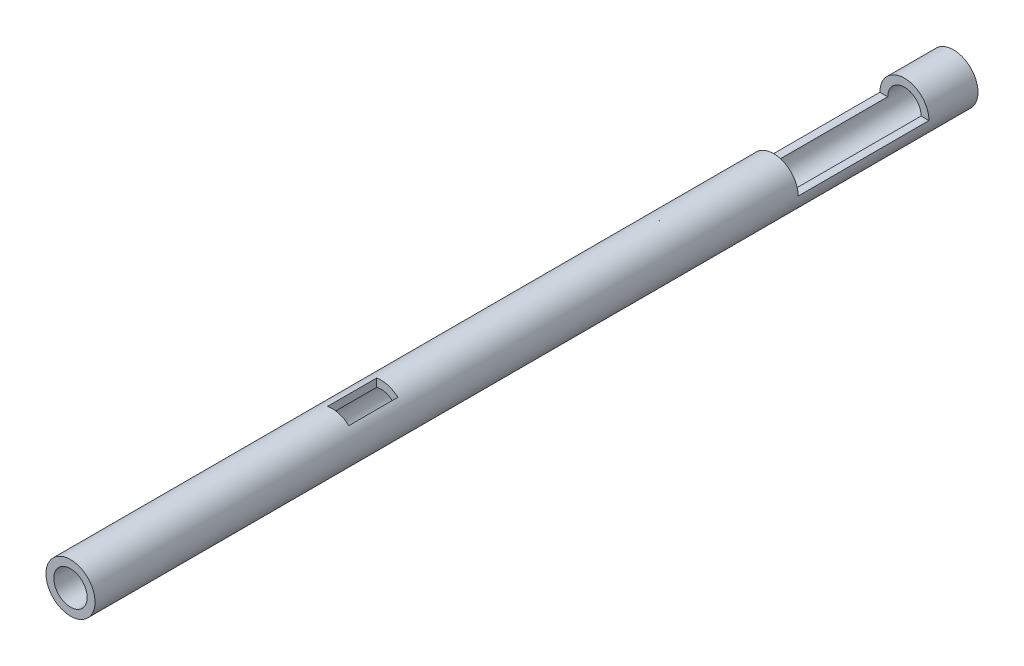
ISO-10303-21;
HEADER;
FILE_DESCRIPTION(('STEP AP214'),'2;1');
FILE_NAME('part.step','',(''),(''),'','','');
FILE_SCHEMA(('AUTOMOTIVE_DESIGN { 1 0 10303 214 1 1 1 1 }'));
ENDSEC;
DATA;
#1=APPLICATION_CONTEXT('core data for automotive mechanical design processes');
#2=APPLICATION_PROTOCOL_DEFINITION('international standard','automotive_design',2000,#1);
#3=PRODUCT_CONTEXT('',#1,'mechanical');
#4=PRODUCT('Part','Part','',(#3));
#5=PRODUCT_RELATED_PRODUCT_CATEGORY('part','',(#4));
#6=PRODUCT_DEFINITION_FORMATION('','',#4);
#7=PRODUCT_DEFINITION_CONTEXT('part definition',#1,'design');
#8=PRODUCT_DEFINITION('design','',#6,#7);
#9=PRODUCT_DEFINITION_SHAPE('','',#8);
#10=(LENGTH_UNIT() NAMED_UNIT(*) SI_UNIT(.MILLI.,.METRE.));
#11=(NAMED_UNIT(*) PLANE_ANGLE_UNIT() SI_UNIT($,.RADIAN.));
#12=(NAMED_UNIT(*) SI_UNIT($,.STERADIAN.) SOLID_ANGLE_UNIT());
#13=UNCERTAINTY_MEASURE_WITH_UNIT(LENGTH_MEASURE(1.E-05),#10,'distance_accuracy_value','');
#14=(GEOMETRIC_REPRESENTATION_CONTEXT(3) GLOBAL_UNCERTAINTY_ASSIGNED_CONTEXT((#13)) GLOBAL_UNIT_ASSIGNED_CONTEXT((#10,
#11,#12)) REPRESENTATION_CONTEXT('',''));
#15=CARTESIAN_POINT('',(0.,0.,0.));
#16=DIRECTION('',(0.,0.,1.));
#17=DIRECTION('',(1.,0.,0.));
#18=AXIS2_PLACEMENT_3D('',#15,#16,#17);
#19=CARTESIAN_POINT('',(0.,0.,685.8));
#20=DIRECTION('',(0.,0.,-1.));
#21=DIRECTION('',(-1.,0.,0.));
#22=AXIS2_PLACEMENT_3D('',#19,#20,#21);
#23=CYLINDRICAL_SURFACE('',#22,19.05);
#24=DIRECTION('',(0.,0.,-1.));
#25=VECTOR('',#24,1.);
#26=CARTESIAN_POINT('',(19.05,0.,685.8));
#27=LINE('',#26,#25);
#28=CARTESIAN_POINT('',(19.05,0.,38.1));
#29=VERTEX_POINT('',#28);
#30=CARTESIAN_POINT('',(19.05,0.,139.7));
#31=VERTEX_POINT('',#30);
#32=EDGE_CURVE('E203',#29,#31,#27,.F.);
#33=ORIENTED_EDGE('',*,*,#32,.T.);
#34=CARTESIAN_POINT('',(0.,0.,139.7));
#35=DIRECTION('',(0.,0.,-1.));
#36=DIRECTION('',(-1.,0.,0.));
#37=AXIS2_PLACEMENT_3D('',#34,#35,#36);
#38=CIRCLE('',#37,19.05);
#39=CARTESIAN_POINT('',(-19.05,0.,139.7));
#40=VERTEX_POINT('',#39);
#41=EDGE_CURVE('E178',#31,#40,#38,.F.);
#42=ORIENTED_EDGE('',*,*,#41,.T.);
#43=DIRECTION('',(0.,0.,-1.));
#44=VECTOR('',#43,1.);
#45=CARTESIAN_POINT('',(-19.05,0.,685.8));
#46=LINE('',#45,#44);
#47=CARTESIAN_POINT('',(-19.05,0.,38.1));
#48=VERTEX_POINT('',#47);
#49=EDGE_CURVE('E199',#40,#48,#46,.T.);
#50=ORIENTED_EDGE('',*,*,#49,.T.);
#51=CARTESIAN_POINT('',(0.,0.,38.1));
#52=DIRECTION('',(0.,0.,1.));
#53=DIRECTION('',(1.,0.,0.));
#54=AXIS2_PLACEMENT_3D('',#51,#52,#53);
#55=CIRCLE('',#54,19.05);
#56=EDGE_CURVE('E174',#48,#29,#55,.F.);
#57=ORIENTED_EDGE('',*,*,#56,.T.);
#58=EDGE_LOOP('',(#33,#42,#50,#57));
#59=FACE_BOUND('',#58,.T.);
#60=CARTESIAN_POINT('',(0.,0.,685.8));
#61=DIRECTION('',(0.,0.,1.));
#62=DIRECTION('',(1.,0.,0.));
#63=AXIS2_PLACEMENT_3D('',#60,#61,#62);
#64=CIRCLE('',#63,19.05);
#65=CARTESIAN_POINT('',(19.05,0.,685.8));
#66=VERTEX_POINT('',#65);
#67=EDGE_CURVE('E11',#66,#66,#64,.T.);
#68=ORIENTED_EDGE('',*,*,#67,.F.);
#69=EDGE_LOOP('',(#68));
#70=FACE_BOUND('',#69,.T.);
#71=CARTESIAN_POINT('',(0.,0.,0.));
#72=DIRECTION('',(0.,0.,1.));
#73=DIRECTION('',(1.,0.,0.));
#74=AXIS2_PLACEMENT_3D('',#71,#72,#73);
#75=CIRCLE('',#74,19.05);
#76=CARTESIAN_POINT('',(19.05,0.,0.));
#77=VERTEX_POINT('',#76);
#78=EDGE_CURVE('E42',#77,#77,#75,.T.);
#79=ORIENTED_EDGE('',*,*,#78,.T.);
#80=EDGE_LOOP('',(#79));
#81=FACE_BOUND('',#80,.T.);
#82=CARTESIAN_POINT('',(0.,0.,444.5));
#83=DIRECTION('',(0.,0.,1.));
#84=DIRECTION('',(1.,0.,0.));
#85=AXIS2_PLACEMENT_3D('',#82,#83,#84);
#86=CIRCLE('',#85,19.05);
#87=CARTESIAN_POINT('',(-3.556,18.7151640121053,444.5));
#88=VERTEX_POINT('',#87);
#89=CARTESIAN_POINT('',(12.954,13.9676907182254,444.5));
#90=VERTEX_POINT('',#89);
#91=EDGE_CURVE('E123',#88,#90,#86,.F.);
#92=ORIENTED_EDGE('',*,*,#91,.T.);
#93=DIRECTION('',(0.,0.,-1.));
#94=VECTOR('',#93,1.);
#95=CARTESIAN_POINT('',(12.954,13.9676907182254,685.8));
#96=LINE('',#95,#94);
#97=CARTESIAN_POINT('',(12.954,13.9676907182254,482.6));
#98=VERTEX_POINT('',#97);
#99=EDGE_CURVE('E164',#90,#98,#96,.F.);
#100=ORIENTED_EDGE('',*,*,#99,.T.);
#101=CARTESIAN_POINT('',(0.,0.,482.6));
#102=DIRECTION('',(0.,0.,-1.));
#103=DIRECTION('',(-1.,0.,0.));
#104=AXIS2_PLACEMENT_3D('',#101,#102,#103);
#105=CIRCLE('',#104,19.05);
#106=CARTESIAN_POINT('',(-3.556,18.7151640121053,482.6));
#107=VERTEX_POINT('',#106);
#108=EDGE_CURVE('E131',#98,#107,#105,.F.);
#109=ORIENTED_EDGE('',*,*,#108,.T.);
#110=DIRECTION('',(0.,0.,-1.));
#111=VECTOR('',#110,1.);
#112=CARTESIAN_POINT('',(-3.556,18.7151640121053,685.8));
#113=LINE('',#112,#111);
#114=EDGE_CURVE('E150',#107,#88,#113,.T.);
#115=ORIENTED_EDGE('',*,*,#114,.T.);
#116=EDGE_LOOP('',(#92,#100,#109,#115));
#117=FACE_BOUND('',#116,.T.);
#118=ADVANCED_FACE('F39',(#59,#70,#81,#117),#23,.T.);
#119=CARTESIAN_POINT('',(0.,0.,685.8));
#120=DIRECTION('',(0.,0.,-1.));
#121=DIRECTION('',(-1.,0.,0.));
#122=AXIS2_PLACEMENT_3D('',#119,#120,#121);
#123=CYLINDRICAL_SURFACE('',#122,12.954);
#124=CARTESIAN_POINT('',(0.,0.,685.8));
#125=DIRECTION('',(0.,0.,1.));
#126=DIRECTION('',(1.,0.,0.));
#127=AXIS2_PLACEMENT_3D('',#124,#125,#126);
#128=CIRCLE('',#127,12.954);
#129=CARTESIAN_POINT('',(12.954,0.,685.8));
#130=VERTEX_POINT('',#129);
#131=EDGE_CURVE('E208',#130,#130,#128,.T.);
#132=ORIENTED_EDGE('',*,*,#131,.T.);
#133=EDGE_LOOP('',(#132));
#134=FACE_BOUND('',#133,.T.);
#135=CARTESIAN_POINT('',(0.,0.,0.));
#136=DIRECTION('',(0.,0.,1.));
#137=DIRECTION('',(1.,0.,0.));
#138=AXIS2_PLACEMENT_3D('',#135,#136,#137);
#139=CIRCLE('',#138,12.954);
#140=CARTESIAN_POINT('',(12.954,0.,0.));
#141=VERTEX_POINT('',#140);
#142=EDGE_CURVE('E207',#141,#141,#139,.T.);
#143=ORIENTED_EDGE('',*,*,#142,.F.);
#144=EDGE_LOOP('',(#143));
#145=FACE_BOUND('',#144,.T.);
#146=CARTESIAN_POINT('',(0.,0.,139.7));
#147=DIRECTION('',(0.,0.,-1.));
#148=DIRECTION('',(-1.,0.,0.));
#149=AXIS2_PLACEMENT_3D('',#146,#147,#148);
#150=CIRCLE('',#149,12.954);
#151=CARTESIAN_POINT('',(12.954,0.,139.7));
#152=VERTEX_POINT('',#151);
#153=CARTESIAN_POINT('',(-12.954,0.,139.7));
#154=VERTEX_POINT('',#153);
#155=EDGE_CURVE('E171',#152,#154,#150,.F.);
#156=ORIENTED_EDGE('',*,*,#155,.F.);
#157=DIRECTION('',(0.,0.,-1.));
#158=VECTOR('',#157,1.);
#159=CARTESIAN_POINT('',(12.954,0.,685.8));
#160=LINE('',#159,#158);
#161=CARTESIAN_POINT('',(12.954,0.,38.1));
#162=VERTEX_POINT('',#161);
#163=EDGE_CURVE('E195',#162,#152,#160,.F.);
#164=ORIENTED_EDGE('',*,*,#163,.F.);
#165=CARTESIAN_POINT('',(0.,0.,38.1));
#166=DIRECTION('',(0.,0.,1.));
#167=DIRECTION('',(1.,0.,0.));
#168=AXIS2_PLACEMENT_3D('',#165,#166,#167);
#169=CIRCLE('',#168,12.954);
#170=CARTESIAN_POINT('',(-12.954,0.,38.1));
#171=VERTEX_POINT('',#170);
#172=EDGE_CURVE('E167',#171,#162,#169,.F.);
#173=ORIENTED_EDGE('',*,*,#172,.F.);
#174=DIRECTION('',(0.,0.,-1.));
#175=VECTOR('',#174,1.);
#176=CARTESIAN_POINT('',(-12.954,0.,685.8));
#177=LINE('',#176,#175);
#178=EDGE_CURVE('E191',#154,#171,#177,.T.);
#179=ORIENTED_EDGE('',*,*,#178,.F.);
#180=EDGE_LOOP('',(#156,#164,#173,#179));
#181=FACE_BOUND('',#180,.T.);
#182=DIRECTION('',(0.,0.,-1.));
#183=VECTOR('',#182,1.);
#184=CARTESIAN_POINT('',(12.954,0.,444.5));
#185=LINE('',#184,#183);
#186=CARTESIAN_POINT('',(12.954,0.,482.6));
#187=VERTEX_POINT('',#186);
#188=CARTESIAN_POINT('',(12.954,0.,444.5));
#189=VERTEX_POINT('',#188);
#190=EDGE_CURVE('E117',#187,#189,#185,.T.);
#191=ORIENTED_EDGE('',*,*,#190,.T.);
#192=CARTESIAN_POINT('',(0.,0.,444.5));
#193=DIRECTION('',(0.,0.,1.));
#194=DIRECTION('',(1.,0.,0.));
#195=AXIS2_PLACEMENT_3D('',#192,#193,#194);
#196=CIRCLE('',#195,12.954);
#197=CARTESIAN_POINT('',(-3.556,12.4563630326031,444.5));
#198=VERTEX_POINT('',#197);
#199=EDGE_CURVE('E144',#198,#189,#196,.F.);
#200=ORIENTED_EDGE('',*,*,#199,.F.);
#201=DIRECTION('',(0.,0.,-1.));
#202=VECTOR('',#201,1.);
#203=CARTESIAN_POINT('',(-3.556,12.4563630326031,685.8));
#204=LINE('',#203,#202);
#205=CARTESIAN_POINT('',(-3.556,12.4563630326031,482.6));
#206=VERTEX_POINT('',#205);
#207=EDGE_CURVE('E138',#206,#198,#204,.T.);
#208=ORIENTED_EDGE('',*,*,#207,.F.);
#209=CARTESIAN_POINT('',(0.,0.,482.6));
#210=DIRECTION('',(0.,0.,-1.));
#211=DIRECTION('',(-1.,0.,0.));
#212=AXIS2_PLACEMENT_3D('',#209,#210,#211);
#213=CIRCLE('',#212,12.954);
#214=EDGE_CURVE('E128',#187,#206,#213,.F.);
#215=ORIENTED_EDGE('',*,*,#214,.F.);
#216=EDGE_LOOP('',(#191,#200,#208,#215));
#217=FACE_BOUND('',#216,.T.);
#218=ADVANCED_FACE('F137',(#134,#145,#181,#217),#123,.F.);
#219=CARTESIAN_POINT('',(0.,0.,685.8));
#220=DIRECTION('',(0.,0.,1.));
#221=DIRECTION('',(1.,0.,0.));
#222=AXIS2_PLACEMENT_3D('',#219,#220,#221);
#223=PLANE('',#222);
#224=ORIENTED_EDGE('',*,*,#67,.T.);
#225=EDGE_LOOP('',(#224));
#226=FACE_BOUND('',#225,.T.);
#227=ORIENTED_EDGE('',*,*,#131,.F.);
#228=EDGE_LOOP('',(#227));
#229=FACE_BOUND('',#228,.T.);
#230=ADVANCED_FACE('F221',(#226,#229),#223,.T.);
#231=CARTESIAN_POINT('',(0.,0.,0.));
#232=DIRECTION('',(0.,0.,1.));
#233=DIRECTION('',(1.,0.,0.));
#234=AXIS2_PLACEMENT_3D('',#231,#232,#233);
#235=PLANE('',#234);
#236=ORIENTED_EDGE('',*,*,#78,.F.);
#237=EDGE_LOOP('',(#236));
#238=FACE_BOUND('',#237,.T.);
#239=ORIENTED_EDGE('',*,*,#142,.T.);
#240=EDGE_LOOP('',(#239));
#241=FACE_BOUND('',#240,.T.);
#242=ADVANCED_FACE('F217',(#238,#241),#235,.F.);
#243=CARTESIAN_POINT('',(-25.4,19.051,139.7));
#244=DIRECTION('',(0.,0.,-1.));
#245=DIRECTION('',(-1.,0.,0.));
#246=AXIS2_PLACEMENT_3D('',#243,#244,#245);
#247=PLANE('',#246);
#248=DIRECTION('',(1.,0.,0.));
#249=VECTOR('',#248,1.);
#250=CARTESIAN_POINT('',(-25.4,0.,139.7));
#251=LINE('',#250,#249);
#252=EDGE_CURVE('E182',#152,#31,#251,.T.);
#253=ORIENTED_EDGE('',*,*,#252,.F.);
#254=ORIENTED_EDGE('',*,*,#155,.T.);
#255=EDGE_CURVE('E186',#40,#154,#251,.T.);
#256=ORIENTED_EDGE('',*,*,#255,.F.);
#257=ORIENTED_EDGE('',*,*,#41,.F.);
#258=EDGE_LOOP('',(#253,#254,#256,#257));
#259=FACE_BOUND('',#258,.T.);
#260=ADVANCED_FACE('F231',(#259),#247,.T.);
#261=CARTESIAN_POINT('',(-25.4,19.051,38.1));
#262=DIRECTION('',(0.,0.,1.));
#263=DIRECTION('',(1.,0.,0.));
#264=AXIS2_PLACEMENT_3D('',#261,#262,#263);
#265=PLANE('',#264);
#266=DIRECTION('',(-1.,0.,0.));
#267=VECTOR('',#266,1.);
#268=CARTESIAN_POINT('',(-25.4,0.,38.1));
#269=LINE('',#268,#267);
#270=EDGE_CURVE('E187',#171,#48,#269,.T.);
#271=ORIENTED_EDGE('',*,*,#270,.F.);
#272=ORIENTED_EDGE('',*,*,#172,.T.);
#273=EDGE_CURVE('E190',#29,#162,#269,.T.);
#274=ORIENTED_EDGE('',*,*,#273,.F.);
#275=ORIENTED_EDGE('',*,*,#56,.F.);
#276=EDGE_LOOP('',(#271,#272,#274,#275));
#277=FACE_BOUND('',#276,.T.);
#278=ADVANCED_FACE('F241',(#277),#265,.T.);
#279=CARTESIAN_POINT('',(0.,0.,0.));
#280=DIRECTION('',(0.,1.,0.));
#281=DIRECTION('',(0.,0.,1.));
#282=AXIS2_PLACEMENT_3D('',#279,#280,#281);
#283=PLANE('',#282);
#284=ORIENTED_EDGE('',*,*,#273,.T.);
#285=ORIENTED_EDGE('',*,*,#163,.T.);
#286=ORIENTED_EDGE('',*,*,#252,.T.);
#287=ORIENTED_EDGE('',*,*,#32,.F.);
#288=EDGE_LOOP('',(#284,#285,#286,#287));
#289=FACE_BOUND('',#288,.T.);
#290=ADVANCED_FACE('F238',(#289),#283,.T.);
#291=ORIENTED_EDGE('',*,*,#255,.T.);
#292=ORIENTED_EDGE('',*,*,#178,.T.);
#293=ORIENTED_EDGE('',*,*,#270,.T.);
#294=ORIENTED_EDGE('',*,*,#49,.F.);
#295=EDGE_LOOP('',(#291,#292,#293,#294));
#296=FACE_BOUND('',#295,.T.);
#297=ADVANCED_FACE('F233',(#296),#283,.T.);
#298=CARTESIAN_POINT('',(-3.556,19.051,444.5));
#299=DIRECTION('',(0.,0.,1.));
#300=DIRECTION('',(1.,0.,0.));
#301=AXIS2_PLACEMENT_3D('',#298,#299,#300);
#302=PLANE('',#301);
#303=DIRECTION('',(0.,-1.,0.));
#304=VECTOR('',#303,1.);
#305=CARTESIAN_POINT('',(-3.556,19.051,444.5));
#306=LINE('',#305,#304);
#307=EDGE_CURVE('E160',#88,#198,#306,.T.);
#308=ORIENTED_EDGE('',*,*,#307,.T.);
#309=ORIENTED_EDGE('',*,*,#199,.T.);
#310=DIRECTION('',(0.,-1.,0.));
#311=VECTOR('',#310,1.);
#312=CARTESIAN_POINT('',(12.954,19.051,444.5));
#313=LINE('',#312,#311);
#314=EDGE_CURVE('E64',#90,#189,#313,.T.);
#315=ORIENTED_EDGE('',*,*,#314,.F.);
#316=ORIENTED_EDGE('',*,*,#91,.F.);
#317=EDGE_LOOP('',(#308,#309,#315,#316));
#318=FACE_BOUND('',#317,.T.);
#319=ADVANCED_FACE('F252',(#318),#302,.T.);
#320=CARTESIAN_POINT('',(-3.556,19.051,482.6));
#321=DIRECTION('',(1.,0.,0.));
#322=DIRECTION('',(0.,0.,-1.));
#323=AXIS2_PLACEMENT_3D('',#320,#321,#322);
#324=PLANE('',#323);
#325=DIRECTION('',(0.,-1.,0.));
#326=VECTOR('',#325,1.);
#327=CARTESIAN_POINT('',(-3.556,19.051,482.6));
#328=LINE('',#327,#326);
#329=EDGE_CURVE('E134',#107,#206,#328,.T.);
#330=ORIENTED_EDGE('',*,*,#329,.T.);
#331=ORIENTED_EDGE('',*,*,#207,.T.);
#332=ORIENTED_EDGE('',*,*,#307,.F.);
#333=ORIENTED_EDGE('',*,*,#114,.F.);
#334=EDGE_LOOP('',(#330,#331,#332,#333));
#335=FACE_BOUND('',#334,.T.);
#336=ADVANCED_FACE('F254',(#335),#324,.T.);
#337=CARTESIAN_POINT('',(12.954,19.051,482.6));
#338=DIRECTION('',(0.,0.,-1.));
#339=DIRECTION('',(-1.,0.,0.));
#340=AXIS2_PLACEMENT_3D('',#337,#338,#339);
#341=PLANE('',#340);
#342=DIRECTION('',(0.,-1.,0.));
#343=VECTOR('',#342,1.);
#344=CARTESIAN_POINT('',(12.954,19.051,482.6));
#345=LINE('',#344,#343);
#346=EDGE_CURVE('E56',#98,#187,#345,.T.);
#347=ORIENTED_EDGE('',*,*,#346,.T.);
#348=ORIENTED_EDGE('',*,*,#214,.T.);
#349=ORIENTED_EDGE('',*,*,#329,.F.);
#350=ORIENTED_EDGE('',*,*,#108,.F.);
#351=EDGE_LOOP('',(#347,#348,#349,#350));
#352=FACE_BOUND('',#351,.T.);
#353=ADVANCED_FACE('F126',(#352),#341,.T.);
#354=CARTESIAN_POINT('',(12.954,19.051,444.5));
#355=DIRECTION('',(-1.,0.,0.));
#356=DIRECTION('',(0.,0.,1.));
#357=AXIS2_PLACEMENT_3D('',#354,#355,#356);
#358=PLANE('',#357);
#359=ORIENTED_EDGE('',*,*,#314,.T.);
#360=ORIENTED_EDGE('',*,*,#190,.F.);
#361=ORIENTED_EDGE('',*,*,#346,.F.);
#362=ORIENTED_EDGE('',*,*,#99,.F.);
#363=EDGE_LOOP('',(#359,#360,#361,#362));
#364=FACE_BOUND('',#363,.T.);
#365=ADVANCED_FACE('F118',(#364),#358,.T.);
#366=CLOSED_SHELL('',(#118,#218,#230,#242,#260,#278,#290,#297,#319,#336,#353,#365));
#367=MANIFOLD_SOLID_BREP('B2',#366);
#368=ADVANCED_BREP_SHAPE_REPRESENTATION('',(#18,#367),#14);
#369=SHAPE_DEFINITION_REPRESENTATION(#9,#368);
ENDSEC;
END-ISO-10303-21;
